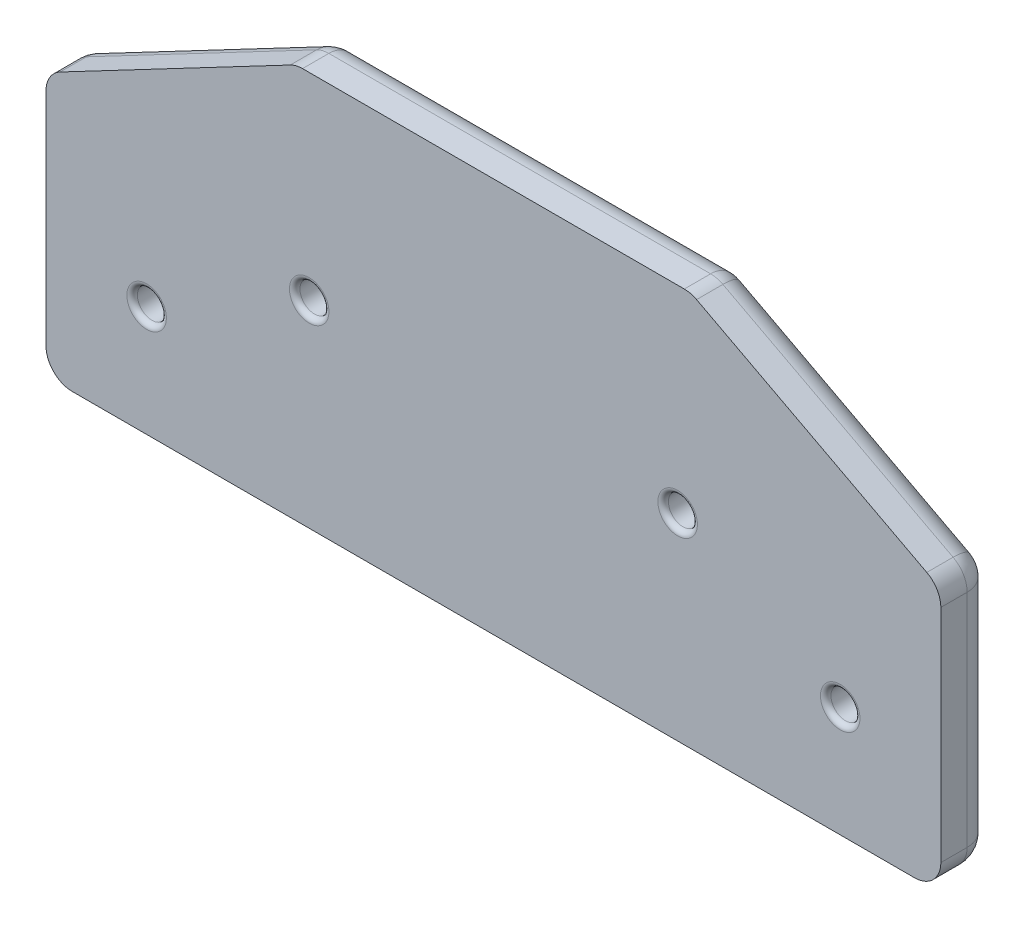
ISO-10303-21;
HEADER;
FILE_DESCRIPTION(('STEP AP214'),'2;1');
FILE_NAME('part.step','',(''),(''),'','','');
FILE_SCHEMA(('AUTOMOTIVE_DESIGN { 1 0 10303 214 1 1 1 1 }'));
ENDSEC;
DATA;
#1=APPLICATION_CONTEXT('core data for automotive mechanical design processes');
#2=APPLICATION_PROTOCOL_DEFINITION('international standard','automotive_design',2000,#1);
#3=PRODUCT_CONTEXT('',#1,'mechanical');
#4=PRODUCT('Part','Part','',(#3));
#5=PRODUCT_RELATED_PRODUCT_CATEGORY('part','',(#4));
#6=PRODUCT_DEFINITION_FORMATION('','',#4);
#7=PRODUCT_DEFINITION_CONTEXT('part definition',#1,'design');
#8=PRODUCT_DEFINITION('design','',#6,#7);
#9=PRODUCT_DEFINITION_SHAPE('','',#8);
#10=(LENGTH_UNIT() NAMED_UNIT(*) SI_UNIT(.MILLI.,.METRE.));
#11=(NAMED_UNIT(*) PLANE_ANGLE_UNIT() SI_UNIT($,.RADIAN.));
#12=(NAMED_UNIT(*) SI_UNIT($,.STERADIAN.) SOLID_ANGLE_UNIT());
#13=UNCERTAINTY_MEASURE_WITH_UNIT(LENGTH_MEASURE(1.E-05),#10,'distance_accuracy_value','');
#14=(GEOMETRIC_REPRESENTATION_CONTEXT(3) GLOBAL_UNCERTAINTY_ASSIGNED_CONTEXT((#13)) GLOBAL_UNIT_ASSIGNED_CONTEXT((#10,
#11,#12)) REPRESENTATION_CONTEXT('',''));
#15=CARTESIAN_POINT('',(0.,0.,0.));
#16=DIRECTION('',(0.,0.,1.));
#17=DIRECTION('',(1.,0.,0.));
#18=AXIS2_PLACEMENT_3D('',#15,#16,#17);
#19=CARTESIAN_POINT('',(170.,0.,10.));
#20=DIRECTION('',(-1.,0.,0.));
#21=DIRECTION('',(0.,0.,1.));
#22=AXIS2_PLACEMENT_3D('',#19,#20,#21);
#23=PLANE('',#22);
#24=DIRECTION('',(0.,0.,-1.));
#25=VECTOR('',#24,1.);
#26=CARTESIAN_POINT('',(170.,5.,10.));
#27=LINE('',#26,#25);
#28=CARTESIAN_POINT('',(170.,5.,10.));
#29=VERTEX_POINT('',#28);
#30=CARTESIAN_POINT('',(170.,5.,5.));
#31=VERTEX_POINT('',#30);
#32=EDGE_CURVE('E163',#29,#31,#27,.T.);
#33=ORIENTED_EDGE('',*,*,#32,.T.);
#34=DIRECTION('',(0.,1.,0.));
#35=VECTOR('',#34,1.);
#36=CARTESIAN_POINT('',(170.,0.,5.));
#37=LINE('',#36,#35);
#38=CARTESIAN_POINT('',(170.,46.9813393280042,5.));
#39=VERTEX_POINT('',#38);
#40=EDGE_CURVE('E236',#31,#39,#37,.T.);
#41=ORIENTED_EDGE('',*,*,#40,.T.);
#42=DIRECTION('',(0.,0.,-1.));
#43=VECTOR('',#42,1.);
#44=CARTESIAN_POINT('',(170.,46.9813393280042,10.));
#45=LINE('',#44,#43);
#46=CARTESIAN_POINT('',(170.,46.9813393280042,10.));
#47=VERTEX_POINT('',#46);
#48=EDGE_CURVE('E166',#39,#47,#45,.F.);
#49=ORIENTED_EDGE('',*,*,#48,.T.);
#50=DIRECTION('',(0.,1.,0.));
#51=VECTOR('',#50,1.);
#52=CARTESIAN_POINT('',(170.,0.,10.));
#53=LINE('',#52,#51);
#54=EDGE_CURVE('E151',#29,#47,#53,.T.);
#55=ORIENTED_EDGE('',*,*,#54,.F.);
#56=EDGE_LOOP('',(#33,#41,#49,#55));
#57=FACE_BOUND('',#56,.T.);
#58=ADVANCED_FACE('F38',(#57),#23,.F.);
#59=CARTESIAN_POINT('',(57.4837310195228,109.219088937093,10.));
#60=DIRECTION('',(-0.465746432832622,-0.884918222381982,0.));
#61=DIRECTION('',(0.884918222381982,-0.465746432832622,0.));
#62=AXIS2_PLACEMENT_3D('',#59,#60,#61);
#63=PLANE('',#62);
#64=DIRECTION('',(0.,0.,-1.));
#65=VECTOR('',#64,1.);
#66=CARTESIAN_POINT('',(167.328732164163,51.4059304399142,10.));
#67=LINE('',#66,#65);
#68=CARTESIAN_POINT('',(167.328732164163,51.4059304399141,10.));
#69=VERTEX_POINT('',#68);
#70=CARTESIAN_POINT('',(167.328732164163,51.4059304399142,5.));
#71=VERTEX_POINT('',#70);
#72=EDGE_CURVE('E195',#69,#71,#67,.T.);
#73=ORIENTED_EDGE('',*,*,#72,.T.);
#74=DIRECTION('',(-0.884918222381982,0.465746432832622,0.));
#75=VECTOR('',#74,1.);
#76=CARTESIAN_POINT('',(57.4837310195228,109.219088937093,5.));
#77=LINE('',#76,#75);
#78=CARTESIAN_POINT('',(123.593276887371,74.4245911119099,5.));
#79=VERTEX_POINT('',#78);
#80=EDGE_CURVE('E232',#71,#79,#77,.T.);
#81=ORIENTED_EDGE('',*,*,#80,.T.);
#82=DIRECTION('',(0.,0.,-1.));
#83=VECTOR('',#82,1.);
#84=CARTESIAN_POINT('',(123.593276887371,74.4245911119099,10.));
#85=LINE('',#84,#83);
#86=CARTESIAN_POINT('',(123.593276887371,74.4245911119099,10.));
#87=VERTEX_POINT('',#86);
#88=EDGE_CURVE('E193',#79,#87,#85,.F.);
#89=ORIENTED_EDGE('',*,*,#88,.T.);
#90=DIRECTION('',(-0.884918222381983,0.465746432832622,0.));
#91=VECTOR('',#90,1.);
#92=CARTESIAN_POINT('',(57.4837310195228,109.219088937093,10.));
#93=LINE('',#92,#91);
#94=EDGE_CURVE('E167',#69,#87,#93,.T.);
#95=ORIENTED_EDGE('',*,*,#94,.F.);
#96=EDGE_LOOP('',(#73,#81,#89,#95));
#97=FACE_BOUND('',#96,.T.);
#98=ADVANCED_FACE('F332',(#97),#63,.F.);
#99=CARTESIAN_POINT('',(0.,75.,10.));
#100=DIRECTION('',(0.,-1.,0.));
#101=DIRECTION('',(1.,0.,0.));
#102=AXIS2_PLACEMENT_3D('',#99,#100,#101);
#103=PLANE('',#102);
#104=DIRECTION('',(0.,0.,-1.));
#105=VECTOR('',#104,1.);
#106=CARTESIAN_POINT('',(121.264544723208,75.,10.));
#107=LINE('',#106,#105);
#108=CARTESIAN_POINT('',(121.264544723208,75.,10.));
#109=VERTEX_POINT('',#108);
#110=CARTESIAN_POINT('',(121.264544723208,75.,5.));
#111=VERTEX_POINT('',#110);
#112=EDGE_CURVE('E200',#109,#111,#107,.T.);
#113=ORIENTED_EDGE('',*,*,#112,.T.);
#114=DIRECTION('',(-1.,0.,0.));
#115=VECTOR('',#114,1.);
#116=CARTESIAN_POINT('',(0.,75.,5.));
#117=LINE('',#116,#115);
#118=CARTESIAN_POINT('',(48.7354552767919,75.,5.));
#119=VERTEX_POINT('',#118);
#120=EDGE_CURVE('E228',#111,#119,#117,.T.);
#121=ORIENTED_EDGE('',*,*,#120,.T.);
#122=DIRECTION('',(0.,0.,-1.));
#123=VECTOR('',#122,1.);
#124=CARTESIAN_POINT('',(48.7354552767919,75.,10.));
#125=LINE('',#124,#123);
#126=CARTESIAN_POINT('',(48.7354552767919,75.,10.));
#127=VERTEX_POINT('',#126);
#128=EDGE_CURVE('E198',#119,#127,#125,.F.);
#129=ORIENTED_EDGE('',*,*,#128,.T.);
#130=DIRECTION('',(-1.,0.,0.));
#131=VECTOR('',#130,1.);
#132=CARTESIAN_POINT('',(0.,75.,10.));
#133=LINE('',#132,#131);
#134=EDGE_CURVE('E487',#109,#127,#133,.T.);
#135=ORIENTED_EDGE('',*,*,#134,.F.);
#136=EDGE_LOOP('',(#113,#121,#129,#135));
#137=FACE_BOUND('',#136,.T.);
#138=ADVANCED_FACE('F337',(#137),#103,.F.);
#139=CARTESIAN_POINT('',(-20.6073752711497,39.1540130151844,10.));
#140=DIRECTION('',(0.465746432832622,-0.884918222381982,0.));
#141=DIRECTION('',(0.884918222381982,0.465746432832622,0.));
#142=AXIS2_PLACEMENT_3D('',#139,#140,#141);
#143=PLANE('',#142);
#144=DIRECTION('',(0.,0.,-1.));
#145=VECTOR('',#144,1.);
#146=CARTESIAN_POINT('',(46.4067231126288,74.4245911119099,10.));
#147=LINE('',#146,#145);
#148=CARTESIAN_POINT('',(46.4067231126288,74.4245911119099,10.));
#149=VERTEX_POINT('',#148);
#150=CARTESIAN_POINT('',(46.4067231126288,74.4245911119099,5.));
#151=VERTEX_POINT('',#150);
#152=EDGE_CURVE('E205',#149,#151,#147,.T.);
#153=ORIENTED_EDGE('',*,*,#152,.T.);
#154=DIRECTION('',(-0.884918222381982,-0.465746432832622,0.));
#155=VECTOR('',#154,1.);
#156=CARTESIAN_POINT('',(-20.6073752711497,39.1540130151844,5.));
#157=LINE('',#156,#155);
#158=CARTESIAN_POINT('',(2.67126783583688,51.4059304399142,5.));
#159=VERTEX_POINT('',#158);
#160=EDGE_CURVE('E211',#151,#159,#157,.T.);
#161=ORIENTED_EDGE('',*,*,#160,.T.);
#162=DIRECTION('',(0.,0.,-1.));
#163=VECTOR('',#162,1.);
#164=CARTESIAN_POINT('',(2.67126783583688,51.4059304399142,10.));
#165=LINE('',#164,#163);
#166=CARTESIAN_POINT('',(2.67126783583688,51.4059304399142,10.));
#167=VERTEX_POINT('',#166);
#168=EDGE_CURVE('E203',#159,#167,#165,.F.);
#169=ORIENTED_EDGE('',*,*,#168,.T.);
#170=DIRECTION('',(-0.884918222381982,-0.465746432832622,0.));
#171=VECTOR('',#170,1.);
#172=CARTESIAN_POINT('',(-20.6073752711497,39.1540130151844,10.));
#173=LINE('',#172,#171);
#174=EDGE_CURVE('E501',#149,#167,#173,.T.);
#175=ORIENTED_EDGE('',*,*,#174,.F.);
#176=EDGE_LOOP('',(#153,#161,#169,#175));
#177=FACE_BOUND('',#176,.T.);
#178=ADVANCED_FACE('F474',(#177),#143,.F.);
#179=CARTESIAN_POINT('',(0.,0.,10.));
#180=DIRECTION('',(1.,0.,0.));
#181=DIRECTION('',(0.,1.,0.));
#182=AXIS2_PLACEMENT_3D('',#179,#180,#181);
#183=PLANE('',#182);
#184=DIRECTION('',(0.,0.,-1.));
#185=VECTOR('',#184,1.);
#186=CARTESIAN_POINT('',(0.,46.9813393280042,10.));
#187=LINE('',#186,#185);
#188=CARTESIAN_POINT('',(0.,46.9813393280042,10.));
#189=VERTEX_POINT('',#188);
#190=CARTESIAN_POINT('',(0.,46.9813393280042,5.));
#191=VERTEX_POINT('',#190);
#192=EDGE_CURVE('E158',#189,#191,#187,.T.);
#193=ORIENTED_EDGE('',*,*,#192,.T.);
#194=DIRECTION('',(0.,-1.,0.));
#195=VECTOR('',#194,1.);
#196=CARTESIAN_POINT('',(0.,0.,5.));
#197=LINE('',#196,#195);
#198=CARTESIAN_POINT('',(0.,5.,5.));
#199=VERTEX_POINT('',#198);
#200=EDGE_CURVE('E53',#191,#199,#197,.T.);
#201=ORIENTED_EDGE('',*,*,#200,.T.);
#202=DIRECTION('',(0.,0.,-1.));
#203=VECTOR('',#202,1.);
#204=CARTESIAN_POINT('',(0.,5.,10.));
#205=LINE('',#204,#203);
#206=CARTESIAN_POINT('',(0.,5.,10.));
#207=VERTEX_POINT('',#206);
#208=EDGE_CURVE('E191',#199,#207,#205,.F.);
#209=ORIENTED_EDGE('',*,*,#208,.T.);
#210=DIRECTION('',(0.,-1.,0.));
#211=VECTOR('',#210,1.);
#212=CARTESIAN_POINT('',(0.,0.,10.));
#213=LINE('',#212,#211);
#214=EDGE_CURVE('E503',#189,#207,#213,.T.);
#215=ORIENTED_EDGE('',*,*,#214,.F.);
#216=EDGE_LOOP('',(#193,#201,#209,#215));
#217=FACE_BOUND('',#216,.T.);
#218=ADVANCED_FACE('F346',(#217),#183,.F.);
#219=CARTESIAN_POINT('',(50.,37.5,10.));
#220=DIRECTION('',(0.,0.,-1.));
#221=DIRECTION('',(-1.,0.,0.));
#222=AXIS2_PLACEMENT_3D('',#219,#220,#221);
#223=CYLINDRICAL_SURFACE('',#222,2.75);
#224=CARTESIAN_POINT('',(50.,37.5,0.999999999999999));
#225=DIRECTION('',(0.,0.,1.));
#226=DIRECTION('',(1.,0.,0.));
#227=AXIS2_PLACEMENT_3D('',#224,#225,#226);
#228=CIRCLE('',#227,2.75);
#229=CARTESIAN_POINT('',(52.75,37.5,0.999999999999999));
#230=VERTEX_POINT('',#229);
#231=EDGE_CURVE('E309',#230,#230,#228,.F.);
#232=ORIENTED_EDGE('',*,*,#231,.T.);
#233=EDGE_LOOP('',(#232));
#234=FACE_BOUND('',#233,.T.);
#235=CARTESIAN_POINT('',(50.,37.5,9.));
#236=DIRECTION('',(0.,0.,1.));
#237=DIRECTION('',(1.,0.,0.));
#238=AXIS2_PLACEMENT_3D('',#235,#236,#237);
#239=CIRCLE('',#238,2.75);
#240=CARTESIAN_POINT('',(52.75,37.5,9.));
#241=VERTEX_POINT('',#240);
#242=EDGE_CURVE('E306',#241,#241,#239,.T.);
#243=ORIENTED_EDGE('',*,*,#242,.T.);
#244=EDGE_LOOP('',(#243));
#245=FACE_BOUND('',#244,.T.);
#246=ADVANCED_FACE('F342',(#234,#245),#223,.F.);
#247=CARTESIAN_POINT('',(120.,37.5,10.));
#248=DIRECTION('',(0.,0.,-1.));
#249=DIRECTION('',(-1.,0.,0.));
#250=AXIS2_PLACEMENT_3D('',#247,#248,#249);
#251=CYLINDRICAL_SURFACE('',#250,2.75000000000001);
#252=CARTESIAN_POINT('',(120.,37.5,0.999999999999999));
#253=DIRECTION('',(0.,0.,1.));
#254=DIRECTION('',(1.,0.,0.));
#255=AXIS2_PLACEMENT_3D('',#252,#253,#254);
#256=CIRCLE('',#255,2.75000000000001);
#257=CARTESIAN_POINT('',(122.75,37.5,0.999999999999999));
#258=VERTEX_POINT('',#257);
#259=EDGE_CURVE('E315',#258,#258,#256,.F.);
#260=ORIENTED_EDGE('',*,*,#259,.T.);
#261=EDGE_LOOP('',(#260));
#262=FACE_BOUND('',#261,.T.);
#263=CARTESIAN_POINT('',(120.,37.5,9.));
#264=DIRECTION('',(0.,0.,1.));
#265=DIRECTION('',(1.,0.,0.));
#266=AXIS2_PLACEMENT_3D('',#263,#264,#265);
#267=CIRCLE('',#266,2.75000000000001);
#268=CARTESIAN_POINT('',(122.75,37.5,9.));
#269=VERTEX_POINT('',#268);
#270=EDGE_CURVE('E312',#269,#269,#267,.T.);
#271=ORIENTED_EDGE('',*,*,#270,.T.);
#272=EDGE_LOOP('',(#271));
#273=FACE_BOUND('',#272,.T.);
#274=ADVANCED_FACE('F345',(#262,#273),#251,.F.);
#275=CARTESIAN_POINT('',(150.882352941177,21.0294117647072,10.));
#276=DIRECTION('',(0.,0.,-1.));
#277=DIRECTION('',(-1.,0.,0.));
#278=AXIS2_PLACEMENT_3D('',#275,#276,#277);
#279=CYLINDRICAL_SURFACE('',#278,2.75000000000001);
#280=CARTESIAN_POINT('',(150.882352941177,21.0294117647072,0.999999999999999));
#281=DIRECTION('',(0.,0.,1.));
#282=DIRECTION('',(1.,0.,0.));
#283=AXIS2_PLACEMENT_3D('',#280,#281,#282);
#284=CIRCLE('',#283,2.75000000000001);
#285=CARTESIAN_POINT('',(153.632352941177,21.0294117647072,0.999999999999999));
#286=VERTEX_POINT('',#285);
#287=EDGE_CURVE('E11',#286,#286,#284,.F.);
#288=ORIENTED_EDGE('',*,*,#287,.T.);
#289=EDGE_LOOP('',(#288));
#290=FACE_BOUND('',#289,.T.);
#291=CARTESIAN_POINT('',(150.882352941177,21.0294117647072,9.));
#292=DIRECTION('',(0.,0.,1.));
#293=DIRECTION('',(1.,0.,0.));
#294=AXIS2_PLACEMENT_3D('',#291,#292,#293);
#295=CIRCLE('',#294,2.75000000000001);
#296=CARTESIAN_POINT('',(153.632352941177,21.0294117647072,9.));
#297=VERTEX_POINT('',#296);
#298=EDGE_CURVE('E46',#297,#297,#295,.T.);
#299=ORIENTED_EDGE('',*,*,#298,.T.);
#300=EDGE_LOOP('',(#299));
#301=FACE_BOUND('',#300,.T.);
#302=ADVANCED_FACE('F320',(#290,#301),#279,.F.);
#303=CARTESIAN_POINT('',(19.1176470588228,21.0294117647072,10.));
#304=DIRECTION('',(0.,0.,-1.));
#305=DIRECTION('',(-1.,0.,0.));
#306=AXIS2_PLACEMENT_3D('',#303,#304,#305);
#307=CYLINDRICAL_SURFACE('',#306,2.75);
#308=CARTESIAN_POINT('',(19.1176470588228,21.0294117647072,0.999999999999999));
#309=DIRECTION('',(0.,0.,1.));
#310=DIRECTION('',(1.,0.,0.));
#311=AXIS2_PLACEMENT_3D('',#308,#309,#310);
#312=CIRCLE('',#311,2.75);
#313=CARTESIAN_POINT('',(21.8676470588228,21.0294117647072,0.999999999999999));
#314=VERTEX_POINT('',#313);
#315=EDGE_CURVE('E291',#314,#314,#312,.F.);
#316=ORIENTED_EDGE('',*,*,#315,.T.);
#317=EDGE_LOOP('',(#316));
#318=FACE_BOUND('',#317,.T.);
#319=CARTESIAN_POINT('',(19.1176470588228,21.0294117647072,9.));
#320=DIRECTION('',(0.,0.,1.));
#321=DIRECTION('',(1.,0.,0.));
#322=AXIS2_PLACEMENT_3D('',#319,#320,#321);
#323=CIRCLE('',#322,2.75);
#324=CARTESIAN_POINT('',(21.8676470588228,21.0294117647072,9.));
#325=VERTEX_POINT('',#324);
#326=EDGE_CURVE('E288',#325,#325,#323,.T.);
#327=ORIENTED_EDGE('',*,*,#326,.T.);
#328=EDGE_LOOP('',(#327));
#329=FACE_BOUND('',#328,.T.);
#330=ADVANCED_FACE('F353',(#318,#329),#307,.F.);
#331=CARTESIAN_POINT('',(0.,0.,10.));
#332=DIRECTION('',(0.,1.,0.));
#333=DIRECTION('',(0.,0.,1.));
#334=AXIS2_PLACEMENT_3D('',#331,#332,#333);
#335=PLANE('',#334);
#336=DIRECTION('',(0.,0.,-1.));
#337=VECTOR('',#336,1.);
#338=CARTESIAN_POINT('',(5.,0.,10.));
#339=LINE('',#338,#337);
#340=CARTESIAN_POINT('',(5.,0.,10.));
#341=VERTEX_POINT('',#340);
#342=CARTESIAN_POINT('',(5.,0.,5.));
#343=VERTEX_POINT('',#342);
#344=EDGE_CURVE('E173',#341,#343,#339,.T.);
#345=ORIENTED_EDGE('',*,*,#344,.T.);
#346=DIRECTION('',(1.,0.,0.));
#347=VECTOR('',#346,1.);
#348=CARTESIAN_POINT('',(0.,0.,5.));
#349=LINE('',#348,#347);
#350=CARTESIAN_POINT('',(165.,0.,5.));
#351=VERTEX_POINT('',#350);
#352=EDGE_CURVE('E239',#343,#351,#349,.T.);
#353=ORIENTED_EDGE('',*,*,#352,.T.);
#354=DIRECTION('',(0.,0.,-1.));
#355=VECTOR('',#354,1.);
#356=CARTESIAN_POINT('',(165.,0.,10.));
#357=LINE('',#356,#355);
#358=CARTESIAN_POINT('',(165.,0.,10.));
#359=VERTEX_POINT('',#358);
#360=EDGE_CURVE('E175',#351,#359,#357,.F.);
#361=ORIENTED_EDGE('',*,*,#360,.T.);
#362=DIRECTION('',(1.,0.,0.));
#363=VECTOR('',#362,1.);
#364=CARTESIAN_POINT('',(0.,0.,10.));
#365=LINE('',#364,#363);
#366=EDGE_CURVE('E154',#341,#359,#365,.T.);
#367=ORIENTED_EDGE('',*,*,#366,.F.);
#368=EDGE_LOOP('',(#345,#353,#361,#367));
#369=FACE_BOUND('',#368,.T.);
#370=ADVANCED_FACE('F357',(#369),#335,.F.);
#371=CARTESIAN_POINT('',(0.,0.,10.));
#372=DIRECTION('',(0.,0.,1.));
#373=DIRECTION('',(1.,0.,0.));
#374=AXIS2_PLACEMENT_3D('',#371,#372,#373);
#375=PLANE('',#374);
#376=CARTESIAN_POINT('',(19.1176470588228,21.0294117647072,10.));
#377=DIRECTION('',(0.,0.,1.));
#378=DIRECTION('',(1.,0.,0.));
#379=AXIS2_PLACEMENT_3D('',#376,#377,#378);
#380=CIRCLE('',#379,3.75);
#381=CARTESIAN_POINT('',(22.8676470588228,21.0294117647072,10.));
#382=VERTEX_POINT('',#381);
#383=EDGE_CURVE('E303',#382,#382,#380,.F.);
#384=ORIENTED_EDGE('',*,*,#383,.T.);
#385=EDGE_LOOP('',(#384));
#386=FACE_BOUND('',#385,.T.);
#387=CARTESIAN_POINT('',(50.,37.5,10.));
#388=DIRECTION('',(0.,0.,1.));
#389=DIRECTION('',(1.,0.,0.));
#390=AXIS2_PLACEMENT_3D('',#387,#388,#389);
#391=CIRCLE('',#390,3.75);
#392=CARTESIAN_POINT('',(53.75,37.5,10.));
#393=VERTEX_POINT('',#392);
#394=EDGE_CURVE('E300',#393,#393,#391,.F.);
#395=ORIENTED_EDGE('',*,*,#394,.T.);
#396=EDGE_LOOP('',(#395));
#397=FACE_BOUND('',#396,.T.);
#398=CARTESIAN_POINT('',(120.,37.5,10.));
#399=DIRECTION('',(0.,0.,1.));
#400=DIRECTION('',(1.,0.,0.));
#401=AXIS2_PLACEMENT_3D('',#398,#399,#400);
#402=CIRCLE('',#401,3.75000000000001);
#403=CARTESIAN_POINT('',(123.75,37.5,10.));
#404=VERTEX_POINT('',#403);
#405=EDGE_CURVE('E297',#404,#404,#402,.F.);
#406=ORIENTED_EDGE('',*,*,#405,.T.);
#407=EDGE_LOOP('',(#406));
#408=FACE_BOUND('',#407,.T.);
#409=CARTESIAN_POINT('',(150.882352941177,21.0294117647072,10.));
#410=DIRECTION('',(0.,0.,1.));
#411=DIRECTION('',(1.,0.,0.));
#412=AXIS2_PLACEMENT_3D('',#409,#410,#411);
#413=CIRCLE('',#412,3.75000000000001);
#414=CARTESIAN_POINT('',(154.632352941177,21.0294117647072,10.));
#415=VERTEX_POINT('',#414);
#416=EDGE_CURVE('E294',#415,#415,#413,.F.);
#417=ORIENTED_EDGE('',*,*,#416,.T.);
#418=EDGE_LOOP('',(#417));
#419=FACE_BOUND('',#418,.T.);
#420=ORIENTED_EDGE('',*,*,#366,.T.);
#421=CARTESIAN_POINT('',(165.,5.,10.));
#422=DIRECTION('',(0.,0.,1.));
#423=DIRECTION('',(1.,0.,0.));
#424=AXIS2_PLACEMENT_3D('',#421,#422,#423);
#425=CIRCLE('',#424,5.);
#426=EDGE_CURVE('E148',#359,#29,#425,.T.);
#427=ORIENTED_EDGE('',*,*,#426,.T.);
#428=ORIENTED_EDGE('',*,*,#54,.T.);
#429=CARTESIAN_POINT('',(165.,46.9813393280042,10.));
#430=DIRECTION('',(0.,0.,1.));
#431=DIRECTION('',(1.,0.,0.));
#432=AXIS2_PLACEMENT_3D('',#429,#430,#431);
#433=CIRCLE('',#432,5.);
#434=EDGE_CURVE('E187',#47,#69,#433,.T.);
#435=ORIENTED_EDGE('',*,*,#434,.T.);
#436=ORIENTED_EDGE('',*,*,#94,.T.);
#437=CARTESIAN_POINT('',(121.264544723208,70.,10.));
#438=DIRECTION('',(0.,0.,1.));
#439=DIRECTION('',(1.,0.,0.));
#440=AXIS2_PLACEMENT_3D('',#437,#438,#439);
#441=CIRCLE('',#440,5.);
#442=EDGE_CURVE('E185',#87,#109,#441,.T.);
#443=ORIENTED_EDGE('',*,*,#442,.T.);
#444=ORIENTED_EDGE('',*,*,#134,.T.);
#445=CARTESIAN_POINT('',(48.7354552767919,70.,10.));
#446=DIRECTION('',(0.,0.,1.));
#447=DIRECTION('',(1.,0.,0.));
#448=AXIS2_PLACEMENT_3D('',#445,#446,#447);
#449=CIRCLE('',#448,5.);
#450=EDGE_CURVE('E183',#127,#149,#449,.T.);
#451=ORIENTED_EDGE('',*,*,#450,.T.);
#452=ORIENTED_EDGE('',*,*,#174,.T.);
#453=CARTESIAN_POINT('',(4.99999999999999,46.9813393280042,10.));
#454=DIRECTION('',(0.,0.,1.));
#455=DIRECTION('',(1.,0.,0.));
#456=AXIS2_PLACEMENT_3D('',#453,#454,#455);
#457=CIRCLE('',#456,5.);
#458=EDGE_CURVE('E181',#167,#189,#457,.T.);
#459=ORIENTED_EDGE('',*,*,#458,.T.);
#460=ORIENTED_EDGE('',*,*,#214,.T.);
#461=CARTESIAN_POINT('',(5.,5.,10.));
#462=DIRECTION('',(0.,0.,1.));
#463=DIRECTION('',(1.,0.,0.));
#464=AXIS2_PLACEMENT_3D('',#461,#462,#463);
#465=CIRCLE('',#464,5.);
#466=EDGE_CURVE('E159',#207,#341,#465,.T.);
#467=ORIENTED_EDGE('',*,*,#466,.T.);
#468=EDGE_LOOP('',(#420,#427,#428,#435,#436,#443,#444,#451,#452,#459,#460,#467));
#469=FACE_BOUND('',#468,.T.);
#470=ADVANCED_FACE('F150',(#386,#397,#408,#419,#469),#375,.T.);
#471=CARTESIAN_POINT('',(0.,0.,0.));
#472=DIRECTION('',(0.,0.,1.));
#473=DIRECTION('',(1.,0.,0.));
#474=AXIS2_PLACEMENT_3D('',#471,#472,#473);
#475=PLANE('',#474);
#476=CARTESIAN_POINT('',(19.1176470588228,21.0294117647072,0.));
#477=DIRECTION('',(0.,0.,1.));
#478=DIRECTION('',(1.,0.,0.));
#479=AXIS2_PLACEMENT_3D('',#476,#477,#478);
#480=CIRCLE('',#479,3.75);
#481=CARTESIAN_POINT('',(22.8676470588228,21.0294117647072,0.));
#482=VERTEX_POINT('',#481);
#483=EDGE_CURVE('E285',#482,#482,#480,.T.);
#484=ORIENTED_EDGE('',*,*,#483,.T.);
#485=EDGE_LOOP('',(#484));
#486=FACE_BOUND('',#485,.T.);
#487=CARTESIAN_POINT('',(50.,37.5,0.));
#488=DIRECTION('',(0.,0.,1.));
#489=DIRECTION('',(1.,0.,0.));
#490=AXIS2_PLACEMENT_3D('',#487,#488,#489);
#491=CIRCLE('',#490,3.75);
#492=CARTESIAN_POINT('',(53.75,37.5,0.));
#493=VERTEX_POINT('',#492);
#494=EDGE_CURVE('E282',#493,#493,#491,.T.);
#495=ORIENTED_EDGE('',*,*,#494,.T.);
#496=EDGE_LOOP('',(#495));
#497=FACE_BOUND('',#496,.T.);
#498=CARTESIAN_POINT('',(120.,37.5,0.));
#499=DIRECTION('',(0.,0.,1.));
#500=DIRECTION('',(1.,0.,0.));
#501=AXIS2_PLACEMENT_3D('',#498,#499,#500);
#502=CIRCLE('',#501,3.75000000000001);
#503=CARTESIAN_POINT('',(123.75,37.5,0.));
#504=VERTEX_POINT('',#503);
#505=EDGE_CURVE('E279',#504,#504,#502,.T.);
#506=ORIENTED_EDGE('',*,*,#505,.T.);
#507=EDGE_LOOP('',(#506));
#508=FACE_BOUND('',#507,.T.);
#509=CARTESIAN_POINT('',(150.882352941177,21.0294117647072,0.));
#510=DIRECTION('',(0.,0.,1.));
#511=DIRECTION('',(1.,0.,0.));
#512=AXIS2_PLACEMENT_3D('',#509,#510,#511);
#513=CIRCLE('',#512,3.75000000000001);
#514=CARTESIAN_POINT('',(154.632352941177,21.0294117647072,0.));
#515=VERTEX_POINT('',#514);
#516=EDGE_CURVE('E243',#515,#515,#513,.T.);
#517=ORIENTED_EDGE('',*,*,#516,.T.);
#518=EDGE_LOOP('',(#517));
#519=FACE_BOUND('',#518,.T.);
#520=DIRECTION('',(0.,-1.,0.));
#521=VECTOR('',#520,1.);
#522=CARTESIAN_POINT('',(5.,0.,0.));
#523=LINE('',#522,#521);
#524=CARTESIAN_POINT('',(5.,5.,0.));
#525=VERTEX_POINT('',#524);
#526=CARTESIAN_POINT('',(4.99999999999999,46.9813393280042,0.));
#527=VERTEX_POINT('',#526);
#528=EDGE_CURVE('E213',#525,#527,#523,.F.);
#529=ORIENTED_EDGE('',*,*,#528,.T.);
#530=DIRECTION('',(-0.884918222381982,-0.465746432832622,0.));
#531=VECTOR('',#530,1.);
#532=CARTESIAN_POINT('',(-18.2786431069866,34.7294219032745,0.));
#533=LINE('',#532,#531);
#534=CARTESIAN_POINT('',(48.7354552767919,70.,0.));
#535=VERTEX_POINT('',#534);
#536=EDGE_CURVE('E223',#527,#535,#533,.F.);
#537=ORIENTED_EDGE('',*,*,#536,.T.);
#538=DIRECTION('',(-1.,0.,0.));
#539=VECTOR('',#538,1.);
#540=CARTESIAN_POINT('',(0.,70.,0.));
#541=LINE('',#540,#539);
#542=CARTESIAN_POINT('',(121.264544723208,70.,0.));
#543=VERTEX_POINT('',#542);
#544=EDGE_CURVE('E221',#535,#543,#541,.F.);
#545=ORIENTED_EDGE('',*,*,#544,.T.);
#546=DIRECTION('',(-0.884918222381982,0.465746432832622,0.));
#547=VECTOR('',#546,1.);
#548=CARTESIAN_POINT('',(55.1549988553597,104.794497825183,0.));
#549=LINE('',#548,#547);
#550=CARTESIAN_POINT('',(165.,46.9813393280042,0.));
#551=VERTEX_POINT('',#550);
#552=EDGE_CURVE('E219',#543,#551,#549,.F.);
#553=ORIENTED_EDGE('',*,*,#552,.T.);
#554=DIRECTION('',(0.,1.,0.));
#555=VECTOR('',#554,1.);
#556=CARTESIAN_POINT('',(165.,0.,0.));
#557=LINE('',#556,#555);
#558=CARTESIAN_POINT('',(165.,5.,0.));
#559=VERTEX_POINT('',#558);
#560=EDGE_CURVE('E217',#551,#559,#557,.F.);
#561=ORIENTED_EDGE('',*,*,#560,.T.);
#562=DIRECTION('',(1.,0.,0.));
#563=VECTOR('',#562,1.);
#564=CARTESIAN_POINT('',(0.,5.,0.));
#565=LINE('',#564,#563);
#566=EDGE_CURVE('E215',#559,#525,#565,.F.);
#567=ORIENTED_EDGE('',*,*,#566,.T.);
#568=EDGE_LOOP('',(#529,#537,#545,#553,#561,#567));
#569=FACE_BOUND('',#568,.T.);
#570=ADVANCED_FACE('F362',(#486,#497,#508,#519,#569),#475,.F.);
#571=CARTESIAN_POINT('',(165.,5.,10.));
#572=DIRECTION('',(0.,0.,-1.));
#573=DIRECTION('',(-1.,0.,0.));
#574=AXIS2_PLACEMENT_3D('',#571,#572,#573);
#575=CYLINDRICAL_SURFACE('',#574,5.);
#576=ORIENTED_EDGE('',*,*,#360,.F.);
#577=CARTESIAN_POINT('',(165.,5.,5.));
#578=DIRECTION('',(0.,0.,-1.));
#579=DIRECTION('',(-1.,0.,0.));
#580=AXIS2_PLACEMENT_3D('',#577,#578,#579);
#581=CIRCLE('',#580,5.);
#582=EDGE_CURVE('E172',#351,#31,#581,.F.);
#583=ORIENTED_EDGE('',*,*,#582,.T.);
#584=ORIENTED_EDGE('',*,*,#32,.F.);
#585=ORIENTED_EDGE('',*,*,#426,.F.);
#586=EDGE_LOOP('',(#576,#583,#584,#585));
#587=FACE_BOUND('',#586,.T.);
#588=ADVANCED_FACE('F170',(#587),#575,.T.);
#589=CARTESIAN_POINT('',(5.,5.,10.));
#590=DIRECTION('',(0.,0.,-1.));
#591=DIRECTION('',(-1.,0.,0.));
#592=AXIS2_PLACEMENT_3D('',#589,#590,#591);
#593=CYLINDRICAL_SURFACE('',#592,5.);
#594=ORIENTED_EDGE('',*,*,#208,.F.);
#595=CARTESIAN_POINT('',(5.,5.,5.));
#596=DIRECTION('',(0.,0.,-1.));
#597=DIRECTION('',(-1.,0.,0.));
#598=AXIS2_PLACEMENT_3D('',#595,#596,#597);
#599=CIRCLE('',#598,5.);
#600=EDGE_CURVE('E60',#199,#343,#599,.F.);
#601=ORIENTED_EDGE('',*,*,#600,.T.);
#602=ORIENTED_EDGE('',*,*,#344,.F.);
#603=ORIENTED_EDGE('',*,*,#466,.F.);
#604=EDGE_LOOP('',(#594,#601,#602,#603));
#605=FACE_BOUND('',#604,.T.);
#606=ADVANCED_FACE('F361',(#605),#593,.T.);
#607=CARTESIAN_POINT('',(165.,46.9813393280042,10.));
#608=DIRECTION('',(0.,0.,-1.));
#609=DIRECTION('',(-1.,0.,0.));
#610=AXIS2_PLACEMENT_3D('',#607,#608,#609);
#611=CYLINDRICAL_SURFACE('',#610,5.);
#612=ORIENTED_EDGE('',*,*,#48,.F.);
#613=CARTESIAN_POINT('',(165.,46.9813393280042,5.));
#614=DIRECTION('',(0.,0.,-1.));
#615=DIRECTION('',(-1.,0.,0.));
#616=AXIS2_PLACEMENT_3D('',#613,#614,#615);
#617=CIRCLE('',#616,5.);
#618=EDGE_CURVE('E234',#39,#71,#617,.F.);
#619=ORIENTED_EDGE('',*,*,#618,.T.);
#620=ORIENTED_EDGE('',*,*,#72,.F.);
#621=ORIENTED_EDGE('',*,*,#434,.F.);
#622=EDGE_LOOP('',(#612,#619,#620,#621));
#623=FACE_BOUND('',#622,.T.);
#624=ADVANCED_FACE('F365',(#623),#611,.T.);
#625=CARTESIAN_POINT('',(121.264544723208,70.,10.));
#626=DIRECTION('',(0.,0.,-1.));
#627=DIRECTION('',(-1.,0.,0.));
#628=AXIS2_PLACEMENT_3D('',#625,#626,#627);
#629=CYLINDRICAL_SURFACE('',#628,5.);
#630=ORIENTED_EDGE('',*,*,#88,.F.);
#631=CARTESIAN_POINT('',(121.264544723208,70.,5.));
#632=DIRECTION('',(0.,0.,-1.));
#633=DIRECTION('',(-1.,0.,0.));
#634=AXIS2_PLACEMENT_3D('',#631,#632,#633);
#635=CIRCLE('',#634,5.);
#636=EDGE_CURVE('E230',#79,#111,#635,.F.);
#637=ORIENTED_EDGE('',*,*,#636,.T.);
#638=ORIENTED_EDGE('',*,*,#112,.F.);
#639=ORIENTED_EDGE('',*,*,#442,.F.);
#640=EDGE_LOOP('',(#630,#637,#638,#639));
#641=FACE_BOUND('',#640,.T.);
#642=ADVANCED_FACE('F368',(#641),#629,.T.);
#643=CARTESIAN_POINT('',(48.7354552767919,70.,10.));
#644=DIRECTION('',(0.,0.,-1.));
#645=DIRECTION('',(-1.,0.,0.));
#646=AXIS2_PLACEMENT_3D('',#643,#644,#645);
#647=CYLINDRICAL_SURFACE('',#646,5.);
#648=ORIENTED_EDGE('',*,*,#128,.F.);
#649=CARTESIAN_POINT('',(48.7354552767919,70.,5.));
#650=DIRECTION('',(0.,0.,-1.));
#651=DIRECTION('',(-1.,0.,0.));
#652=AXIS2_PLACEMENT_3D('',#649,#650,#651);
#653=CIRCLE('',#652,5.);
#654=EDGE_CURVE('E226',#119,#151,#653,.F.);
#655=ORIENTED_EDGE('',*,*,#654,.T.);
#656=ORIENTED_EDGE('',*,*,#152,.F.);
#657=ORIENTED_EDGE('',*,*,#450,.F.);
#658=EDGE_LOOP('',(#648,#655,#656,#657));
#659=FACE_BOUND('',#658,.T.);
#660=ADVANCED_FACE('F372',(#659),#647,.T.);
#661=CARTESIAN_POINT('',(4.99999999999999,46.9813393280042,10.));
#662=DIRECTION('',(0.,0.,-1.));
#663=DIRECTION('',(-1.,0.,0.));
#664=AXIS2_PLACEMENT_3D('',#661,#662,#663);
#665=CYLINDRICAL_SURFACE('',#664,5.);
#666=ORIENTED_EDGE('',*,*,#168,.F.);
#667=CARTESIAN_POINT('',(4.99999999999999,46.9813393280042,5.));
#668=DIRECTION('',(0.,0.,-1.));
#669=DIRECTION('',(-1.,0.,0.));
#670=AXIS2_PLACEMENT_3D('',#667,#668,#669);
#671=CIRCLE('',#670,5.);
#672=EDGE_CURVE('E208',#159,#191,#671,.F.);
#673=ORIENTED_EDGE('',*,*,#672,.T.);
#674=ORIENTED_EDGE('',*,*,#192,.F.);
#675=ORIENTED_EDGE('',*,*,#458,.F.);
#676=EDGE_LOOP('',(#666,#673,#674,#675));
#677=FACE_BOUND('',#676,.T.);
#678=ADVANCED_FACE('F376',(#677),#665,.T.);
#679=CARTESIAN_POINT('',(165.,46.9813393280042,5.));
#680=DIRECTION('',(0.,0.,1.));
#681=DIRECTION('',(1.,0.,0.));
#682=AXIS2_PLACEMENT_3D('',#679,#680,#681);
#683=SPHERICAL_SURFACE('',#682,5.);
#684=CARTESIAN_POINT('',(165.,46.9813393280042,5.));
#685=DIRECTION('',(-0.884918222381984,0.46574643283262,0.));
#686=DIRECTION('',(-0.46574643283262,-0.884918222381984,0.));
#687=AXIS2_PLACEMENT_3D('',#684,#685,#686);
#688=CIRCLE('',#687,5.);
#689=EDGE_CURVE('E272',#71,#551,#688,.T.);
#690=ORIENTED_EDGE('',*,*,#689,.F.);
#691=ORIENTED_EDGE('',*,*,#618,.F.);
#692=CARTESIAN_POINT('',(165.,46.9813393280042,5.));
#693=DIRECTION('',(0.,-1.,0.));
#694=DIRECTION('',(0.,0.,-1.));
#695=AXIS2_PLACEMENT_3D('',#692,#693,#694);
#696=CIRCLE('',#695,5.);
#697=EDGE_CURVE('E168',#551,#39,#696,.T.);
#698=ORIENTED_EDGE('',*,*,#697,.F.);
#699=EDGE_LOOP('',(#690,#691,#698));
#700=FACE_BOUND('',#699,.T.);
#701=ADVANCED_FACE('F380',(#700),#683,.T.);
#702=CARTESIAN_POINT('',(165.,0.,5.));
#703=DIRECTION('',(0.,1.,0.));
#704=DIRECTION('',(0.,0.,1.));
#705=AXIS2_PLACEMENT_3D('',#702,#703,#704);
#706=CYLINDRICAL_SURFACE('',#705,5.);
#707=ORIENTED_EDGE('',*,*,#697,.T.);
#708=ORIENTED_EDGE('',*,*,#40,.F.);
#709=CARTESIAN_POINT('',(165.,5.,5.));
#710=DIRECTION('',(0.,-1.,0.));
#711=DIRECTION('',(0.,0.,-1.));
#712=AXIS2_PLACEMENT_3D('',#709,#710,#711);
#713=CIRCLE('',#712,5.);
#714=EDGE_CURVE('E269',#559,#31,#713,.T.);
#715=ORIENTED_EDGE('',*,*,#714,.F.);
#716=ORIENTED_EDGE('',*,*,#560,.F.);
#717=EDGE_LOOP('',(#707,#708,#715,#716));
#718=FACE_BOUND('',#717,.T.);
#719=ADVANCED_FACE('F422',(#718),#706,.T.);
#720=CARTESIAN_POINT('',(55.1549988553597,104.794497825183,5.));
#721=DIRECTION('',(-0.884918222381982,0.465746432832622,0.));
#722=DIRECTION('',(-0.465746432832622,-0.884918222381982,0.));
#723=AXIS2_PLACEMENT_3D('',#720,#721,#722);
#724=CYLINDRICAL_SURFACE('',#723,5.);
#725=ORIENTED_EDGE('',*,*,#689,.T.);
#726=ORIENTED_EDGE('',*,*,#552,.F.);
#727=CARTESIAN_POINT('',(121.264544723208,70.,5.));
#728=DIRECTION('',(-0.884918222381982,0.465746432832622,0.));
#729=DIRECTION('',(-0.465746432832622,-0.884918222381982,0.));
#730=AXIS2_PLACEMENT_3D('',#727,#728,#729);
#731=CIRCLE('',#730,5.);
#732=EDGE_CURVE('E266',#79,#543,#731,.T.);
#733=ORIENTED_EDGE('',*,*,#732,.F.);
#734=ORIENTED_EDGE('',*,*,#80,.F.);
#735=EDGE_LOOP('',(#725,#726,#733,#734));
#736=FACE_BOUND('',#735,.T.);
#737=ADVANCED_FACE('F418',(#736),#724,.T.);
#738=CARTESIAN_POINT('',(165.,5.,5.));
#739=DIRECTION('',(0.,0.,1.));
#740=DIRECTION('',(1.,0.,0.));
#741=AXIS2_PLACEMENT_3D('',#738,#739,#740);
#742=SPHERICAL_SURFACE('',#741,5.);
#743=ORIENTED_EDGE('',*,*,#714,.T.);
#744=ORIENTED_EDGE('',*,*,#582,.F.);
#745=CARTESIAN_POINT('',(165.,5.,5.));
#746=DIRECTION('',(-1.,0.,0.));
#747=DIRECTION('',(0.,0.,1.));
#748=AXIS2_PLACEMENT_3D('',#745,#746,#747);
#749=CIRCLE('',#748,5.);
#750=EDGE_CURVE('E263',#559,#351,#749,.T.);
#751=ORIENTED_EDGE('',*,*,#750,.F.);
#752=EDGE_LOOP('',(#743,#744,#751));
#753=FACE_BOUND('',#752,.T.);
#754=ADVANCED_FACE('F414',(#753),#742,.T.);
#755=CARTESIAN_POINT('',(121.264544723208,70.,5.));
#756=DIRECTION('',(0.,0.,1.));
#757=DIRECTION('',(1.,0.,0.));
#758=AXIS2_PLACEMENT_3D('',#755,#756,#757);
#759=SPHERICAL_SURFACE('',#758,5.);
#760=ORIENTED_EDGE('',*,*,#636,.F.);
#761=ORIENTED_EDGE('',*,*,#732,.T.);
#762=CARTESIAN_POINT('',(121.264544723208,70.,5.));
#763=DIRECTION('',(-1.,0.,0.));
#764=DIRECTION('',(0.,0.,1.));
#765=AXIS2_PLACEMENT_3D('',#762,#763,#764);
#766=CIRCLE('',#765,5.);
#767=EDGE_CURVE('E260',#111,#543,#766,.T.);
#768=ORIENTED_EDGE('',*,*,#767,.F.);
#769=EDGE_LOOP('',(#760,#761,#768));
#770=FACE_BOUND('',#769,.T.);
#771=ADVANCED_FACE('F410',(#770),#759,.T.);
#772=CARTESIAN_POINT('',(0.,5.,5.));
#773=DIRECTION('',(1.,0.,0.));
#774=DIRECTION('',(0.,0.,-1.));
#775=AXIS2_PLACEMENT_3D('',#772,#773,#774);
#776=CYLINDRICAL_SURFACE('',#775,5.);
#777=ORIENTED_EDGE('',*,*,#750,.T.);
#778=ORIENTED_EDGE('',*,*,#352,.F.);
#779=CARTESIAN_POINT('',(5.,5.,5.));
#780=DIRECTION('',(-1.,0.,0.));
#781=DIRECTION('',(0.,0.,1.));
#782=AXIS2_PLACEMENT_3D('',#779,#780,#781);
#783=CIRCLE('',#782,5.);
#784=EDGE_CURVE('E257',#525,#343,#783,.T.);
#785=ORIENTED_EDGE('',*,*,#784,.F.);
#786=ORIENTED_EDGE('',*,*,#566,.F.);
#787=EDGE_LOOP('',(#777,#778,#785,#786));
#788=FACE_BOUND('',#787,.T.);
#789=ADVANCED_FACE('F406',(#788),#776,.T.);
#790=CARTESIAN_POINT('',(0.,70.,5.));
#791=DIRECTION('',(-1.,0.,0.));
#792=DIRECTION('',(0.,-1.,0.));
#793=AXIS2_PLACEMENT_3D('',#790,#791,#792);
#794=CYLINDRICAL_SURFACE('',#793,5.);
#795=ORIENTED_EDGE('',*,*,#767,.T.);
#796=ORIENTED_EDGE('',*,*,#544,.F.);
#797=CARTESIAN_POINT('',(48.7354552767919,70.,5.));
#798=DIRECTION('',(-1.,0.,0.));
#799=DIRECTION('',(0.,0.,1.));
#800=AXIS2_PLACEMENT_3D('',#797,#798,#799);
#801=CIRCLE('',#800,5.);
#802=EDGE_CURVE('E254',#119,#535,#801,.T.);
#803=ORIENTED_EDGE('',*,*,#802,.F.);
#804=ORIENTED_EDGE('',*,*,#120,.F.);
#805=EDGE_LOOP('',(#795,#796,#803,#804));
#806=FACE_BOUND('',#805,.T.);
#807=ADVANCED_FACE('F402',(#806),#794,.T.);
#808=CARTESIAN_POINT('',(5.,5.,5.));
#809=DIRECTION('',(0.,0.,1.));
#810=DIRECTION('',(1.,0.,0.));
#811=AXIS2_PLACEMENT_3D('',#808,#809,#810);
#812=SPHERICAL_SURFACE('',#811,5.);
#813=ORIENTED_EDGE('',*,*,#784,.T.);
#814=ORIENTED_EDGE('',*,*,#600,.F.);
#815=CARTESIAN_POINT('',(5.,5.,5.));
#816=DIRECTION('',(0.,1.,0.));
#817=DIRECTION('',(-1.,0.,0.));
#818=AXIS2_PLACEMENT_3D('',#815,#816,#817);
#819=CIRCLE('',#818,5.);
#820=EDGE_CURVE('E251',#525,#199,#819,.T.);
#821=ORIENTED_EDGE('',*,*,#820,.F.);
#822=EDGE_LOOP('',(#813,#814,#821));
#823=FACE_BOUND('',#822,.T.);
#824=ADVANCED_FACE('F398',(#823),#812,.T.);
#825=CARTESIAN_POINT('',(48.7354552767919,70.,5.));
#826=DIRECTION('',(0.,0.,1.));
#827=DIRECTION('',(1.,0.,0.));
#828=AXIS2_PLACEMENT_3D('',#825,#826,#827);
#829=SPHERICAL_SURFACE('',#828,5.);
#830=ORIENTED_EDGE('',*,*,#654,.F.);
#831=ORIENTED_EDGE('',*,*,#802,.T.);
#832=CARTESIAN_POINT('',(48.7354552767919,70.,5.));
#833=DIRECTION('',(-0.884918222381984,-0.465746432832619,0.));
#834=DIRECTION('',(0.465746432832619,-0.884918222381984,0.));
#835=AXIS2_PLACEMENT_3D('',#832,#833,#834);
#836=CIRCLE('',#835,5.);
#837=EDGE_CURVE('E249',#151,#535,#836,.T.);
#838=ORIENTED_EDGE('',*,*,#837,.F.);
#839=EDGE_LOOP('',(#830,#831,#838));
#840=FACE_BOUND('',#839,.T.);
#841=ADVANCED_FACE('F394',(#840),#829,.T.);
#842=CARTESIAN_POINT('',(5.,0.,5.));
#843=DIRECTION('',(0.,-1.,0.));
#844=DIRECTION('',(1.,0.,0.));
#845=AXIS2_PLACEMENT_3D('',#842,#843,#844);
#846=CYLINDRICAL_SURFACE('',#845,5.);
#847=ORIENTED_EDGE('',*,*,#820,.T.);
#848=ORIENTED_EDGE('',*,*,#200,.F.);
#849=CARTESIAN_POINT('',(4.99999999999999,46.9813393280042,5.));
#850=DIRECTION('',(0.,1.,0.));
#851=DIRECTION('',(0.,0.,1.));
#852=AXIS2_PLACEMENT_3D('',#849,#850,#851);
#853=CIRCLE('',#852,5.);
#854=EDGE_CURVE('E247',#527,#191,#853,.T.);
#855=ORIENTED_EDGE('',*,*,#854,.F.);
#856=ORIENTED_EDGE('',*,*,#528,.F.);
#857=EDGE_LOOP('',(#847,#848,#855,#856));
#858=FACE_BOUND('',#857,.T.);
#859=ADVANCED_FACE('F390',(#858),#846,.T.);
#860=CARTESIAN_POINT('',(-18.2786431069866,34.7294219032745,5.));
#861=DIRECTION('',(-0.884918222381982,-0.465746432832622,0.));
#862=DIRECTION('',(0.465746432832622,-0.884918222381982,0.));
#863=AXIS2_PLACEMENT_3D('',#860,#861,#862);
#864=CYLINDRICAL_SURFACE('',#863,5.);
#865=ORIENTED_EDGE('',*,*,#837,.T.);
#866=ORIENTED_EDGE('',*,*,#536,.F.);
#867=CARTESIAN_POINT('',(5.,46.9813393280042,5.));
#868=DIRECTION('',(-0.884918222381982,-0.465746432832622,0.));
#869=DIRECTION('',(0.465746432832622,-0.884918222381982,0.));
#870=AXIS2_PLACEMENT_3D('',#867,#868,#869);
#871=CIRCLE('',#870,5.);
#872=EDGE_CURVE('E244',#159,#527,#871,.T.);
#873=ORIENTED_EDGE('',*,*,#872,.F.);
#874=ORIENTED_EDGE('',*,*,#160,.F.);
#875=EDGE_LOOP('',(#865,#866,#873,#874));
#876=FACE_BOUND('',#875,.T.);
#877=ADVANCED_FACE('F386',(#876),#864,.T.);
#878=CARTESIAN_POINT('',(4.99999999999999,46.9813393280042,5.));
#879=DIRECTION('',(0.,0.,1.));
#880=DIRECTION('',(1.,0.,0.));
#881=AXIS2_PLACEMENT_3D('',#878,#879,#880);
#882=SPHERICAL_SURFACE('',#881,5.);
#883=ORIENTED_EDGE('',*,*,#854,.T.);
#884=ORIENTED_EDGE('',*,*,#672,.F.);
#885=ORIENTED_EDGE('',*,*,#872,.T.);
#886=EDGE_LOOP('',(#883,#884,#885));
#887=FACE_BOUND('',#886,.T.);
#888=ADVANCED_FACE('F382',(#887),#882,.T.);
#889=CARTESIAN_POINT('',(19.1176470588228,21.0294117647072,0.999999999999999));
#890=DIRECTION('',(0.,0.,1.));
#891=DIRECTION('',(1.,0.,0.));
#892=AXIS2_PLACEMENT_3D('',#889,#890,#891);
#893=TOROIDAL_SURFACE('',#892,3.75,1.);
#894=ORIENTED_EDGE('',*,*,#315,.F.);
#895=EDGE_LOOP('',(#894));
#896=FACE_BOUND('',#895,.T.);
#897=ORIENTED_EDGE('',*,*,#483,.F.);
#898=EDGE_LOOP('',(#897));
#899=FACE_BOUND('',#898,.T.);
#900=ADVANCED_FACE('F385',(#896,#899),#893,.T.);
#901=CARTESIAN_POINT('',(19.1176470588228,21.0294117647072,9.));
#902=DIRECTION('',(0.,0.,1.));
#903=DIRECTION('',(1.,0.,0.));
#904=AXIS2_PLACEMENT_3D('',#901,#902,#903);
#905=TOROIDAL_SURFACE('',#904,3.75,1.);
#906=ORIENTED_EDGE('',*,*,#383,.F.);
#907=EDGE_LOOP('',(#906));
#908=FACE_BOUND('',#907,.T.);
#909=ORIENTED_EDGE('',*,*,#326,.F.);
#910=EDGE_LOOP('',(#909));
#911=FACE_BOUND('',#910,.T.);
#912=ADVANCED_FACE('F432',(#908,#911),#905,.T.);
#913=CARTESIAN_POINT('',(50.,37.5,0.999999999999999));
#914=DIRECTION('',(0.,0.,1.));
#915=DIRECTION('',(1.,0.,0.));
#916=AXIS2_PLACEMENT_3D('',#913,#914,#915);
#917=TOROIDAL_SURFACE('',#916,3.75,1.);
#918=ORIENTED_EDGE('',*,*,#231,.F.);
#919=EDGE_LOOP('',(#918));
#920=FACE_BOUND('',#919,.T.);
#921=ORIENTED_EDGE('',*,*,#494,.F.);
#922=EDGE_LOOP('',(#921));
#923=FACE_BOUND('',#922,.T.);
#924=ADVANCED_FACE('F436',(#920,#923),#917,.T.);
#925=CARTESIAN_POINT('',(50.,37.5,9.));
#926=DIRECTION('',(0.,0.,1.));
#927=DIRECTION('',(1.,0.,0.));
#928=AXIS2_PLACEMENT_3D('',#925,#926,#927);
#929=TOROIDAL_SURFACE('',#928,3.75,1.);
#930=ORIENTED_EDGE('',*,*,#394,.F.);
#931=EDGE_LOOP('',(#930));
#932=FACE_BOUND('',#931,.T.);
#933=ORIENTED_EDGE('',*,*,#242,.F.);
#934=EDGE_LOOP('',(#933));
#935=FACE_BOUND('',#934,.T.);
#936=ADVANCED_FACE('F440',(#932,#935),#929,.T.);
#937=CARTESIAN_POINT('',(120.,37.5,0.999999999999999));
#938=DIRECTION('',(0.,0.,1.));
#939=DIRECTION('',(1.,0.,0.));
#940=AXIS2_PLACEMENT_3D('',#937,#938,#939);
#941=TOROIDAL_SURFACE('',#940,3.75000000000001,1.);
#942=ORIENTED_EDGE('',*,*,#259,.F.);
#943=EDGE_LOOP('',(#942));
#944=FACE_BOUND('',#943,.T.);
#945=ORIENTED_EDGE('',*,*,#505,.F.);
#946=EDGE_LOOP('',(#945));
#947=FACE_BOUND('',#946,.T.);
#948=ADVANCED_FACE('F444',(#944,#947),#941,.T.);
#949=CARTESIAN_POINT('',(120.,37.5,9.));
#950=DIRECTION('',(0.,0.,1.));
#951=DIRECTION('',(1.,0.,0.));
#952=AXIS2_PLACEMENT_3D('',#949,#950,#951);
#953=TOROIDAL_SURFACE('',#952,3.75000000000001,1.);
#954=ORIENTED_EDGE('',*,*,#405,.F.);
#955=EDGE_LOOP('',(#954));
#956=FACE_BOUND('',#955,.T.);
#957=ORIENTED_EDGE('',*,*,#270,.F.);
#958=EDGE_LOOP('',(#957));
#959=FACE_BOUND('',#958,.T.);
#960=ADVANCED_FACE('F328',(#956,#959),#953,.T.);
#961=CARTESIAN_POINT('',(150.882352941177,21.0294117647072,0.999999999999999));
#962=DIRECTION('',(0.,0.,1.));
#963=DIRECTION('',(1.,0.,0.));
#964=AXIS2_PLACEMENT_3D('',#961,#962,#963);
#965=TOROIDAL_SURFACE('',#964,3.75000000000001,1.);
#966=ORIENTED_EDGE('',*,*,#287,.F.);
#967=EDGE_LOOP('',(#966));
#968=FACE_BOUND('',#967,.T.);
#969=ORIENTED_EDGE('',*,*,#516,.F.);
#970=EDGE_LOOP('',(#969));
#971=FACE_BOUND('',#970,.T.);
#972=ADVANCED_FACE('F323',(#968,#971),#965,.T.);
#973=CARTESIAN_POINT('',(150.882352941177,21.0294117647072,9.));
#974=DIRECTION('',(0.,0.,1.));
#975=DIRECTION('',(1.,0.,0.));
#976=AXIS2_PLACEMENT_3D('',#973,#974,#975);
#977=TOROIDAL_SURFACE('',#976,3.75000000000001,1.);
#978=ORIENTED_EDGE('',*,*,#416,.F.);
#979=EDGE_LOOP('',(#978));
#980=FACE_BOUND('',#979,.T.);
#981=ORIENTED_EDGE('',*,*,#298,.F.);
#982=EDGE_LOOP('',(#981));
#983=FACE_BOUND('',#982,.T.);
#984=ADVANCED_FACE('F40',(#980,#983),#977,.T.);
#985=CLOSED_SHELL('',(#58,#98,#138,#178,#218,#246,#274,#302,#330,#370,#470,#570,#588,#606,#624,
#642,#660,#678,#701,#719,#737,#754,#771,#789,#807,#824,#841,#859,#877,#888,#900,#912,#924,#936,
#948,#960,#972,#984));
#986=MANIFOLD_SOLID_BREP('B2',#985);
#987=ADVANCED_BREP_SHAPE_REPRESENTATION('',(#18,#986),#14);
#988=SHAPE_DEFINITION_REPRESENTATION(#9,#987);
ENDSEC;
END-ISO-10303-21;
